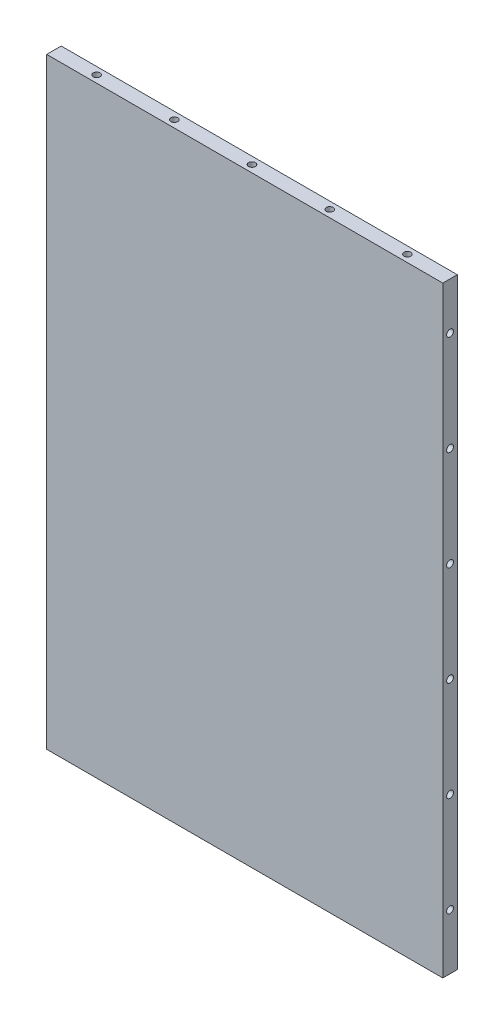
ISO-10303-21;
HEADER;
FILE_DESCRIPTION(('STEP AP214'),'2;1');
FILE_NAME('part.step','',(''),(''),'','','');
FILE_SCHEMA(('AUTOMOTIVE_DESIGN { 1 0 10303 214 1 1 1 1 }'));
ENDSEC;
DATA;
#1=APPLICATION_CONTEXT('core data for automotive mechanical design processes');
#2=APPLICATION_PROTOCOL_DEFINITION('international standard','automotive_design',2000,#1);
#3=PRODUCT_CONTEXT('',#1,'mechanical');
#4=PRODUCT('Part','Part','',(#3));
#5=PRODUCT_RELATED_PRODUCT_CATEGORY('part','',(#4));
#6=PRODUCT_DEFINITION_FORMATION('','',#4);
#7=PRODUCT_DEFINITION_CONTEXT('part definition',#1,'design');
#8=PRODUCT_DEFINITION('design','',#6,#7);
#9=PRODUCT_DEFINITION_SHAPE('','',#8);
#10=(LENGTH_UNIT() NAMED_UNIT(*) SI_UNIT(.MILLI.,.METRE.));
#11=(NAMED_UNIT(*) PLANE_ANGLE_UNIT() SI_UNIT($,.RADIAN.));
#12=(NAMED_UNIT(*) SI_UNIT($,.STERADIAN.) SOLID_ANGLE_UNIT());
#13=UNCERTAINTY_MEASURE_WITH_UNIT(LENGTH_MEASURE(1.E-05),#10,'distance_accuracy_value','');
#14=(GEOMETRIC_REPRESENTATION_CONTEXT(3) GLOBAL_UNCERTAINTY_ASSIGNED_CONTEXT((#13)) GLOBAL_UNIT_ASSIGNED_CONTEXT((#10,
#11,#12)) REPRESENTATION_CONTEXT('',''));
#15=CARTESIAN_POINT('',(0.,0.,0.));
#16=DIRECTION('',(0.,0.,1.));
#17=DIRECTION('',(1.,0.,0.));
#18=AXIS2_PLACEMENT_3D('',#15,#16,#17);
#19=CARTESIAN_POINT('',(232.,-733.,17.));
#20=DIRECTION('',(0.,1.,0.));
#21=DIRECTION('',(0.,0.,1.));
#22=AXIS2_PLACEMENT_3D('',#19,#20,#21);
#23=PLANE('',#22);
#24=CARTESIAN_POINT('',(0.,-733.,8.50000000000006));
#25=DIRECTION('',(0.,1.,0.));
#26=DIRECTION('',(0.,0.,1.));
#27=AXIS2_PLACEMENT_3D('',#24,#25,#26);
#28=CIRCLE('',#27,4.00000000000001);
#29=CARTESIAN_POINT('',(0.,-733.,12.5000000000001));
#30=VERTEX_POINT('',#29);
#31=EDGE_CURVE('E200',#30,#30,#28,.F.);
#32=ORIENTED_EDGE('',*,*,#31,.F.);
#33=EDGE_LOOP('',(#32));
#34=FACE_BOUND('',#33,.T.);
#35=CARTESIAN_POINT('',(-182.,-733.,8.50000000000009));
#36=DIRECTION('',(0.,1.,0.));
#37=DIRECTION('',(0.,0.,1.));
#38=AXIS2_PLACEMENT_3D('',#35,#36,#37);
#39=CIRCLE('',#38,3.99999999999999);
#40=CARTESIAN_POINT('',(-182.,-733.,12.5000000000001));
#41=VERTEX_POINT('',#40);
#42=EDGE_CURVE('E193',#41,#41,#39,.F.);
#43=ORIENTED_EDGE('',*,*,#42,.F.);
#44=EDGE_LOOP('',(#43));
#45=FACE_BOUND('',#44,.T.);
#46=DIRECTION('',(1.,0.,0.));
#47=VECTOR('',#46,1.);
#48=CARTESIAN_POINT('',(232.,-733.,0.));
#49=LINE('',#48,#47);
#50=CARTESIAN_POINT('',(-232.,-733.,0.));
#51=VERTEX_POINT('',#50);
#52=CARTESIAN_POINT('',(232.,-733.,0.));
#53=VERTEX_POINT('',#52);
#54=EDGE_CURVE('E87',#51,#53,#49,.T.);
#55=ORIENTED_EDGE('',*,*,#54,.T.);
#56=DIRECTION('',(0.,0.,-1.));
#57=VECTOR('',#56,1.);
#58=CARTESIAN_POINT('',(232.,-733.,17.));
#59=LINE('',#58,#57);
#60=CARTESIAN_POINT('',(232.,-733.,17.));
#61=VERTEX_POINT('',#60);
#62=EDGE_CURVE('E109',#61,#53,#59,.T.);
#63=ORIENTED_EDGE('',*,*,#62,.F.);
#64=DIRECTION('',(1.,0.,0.));
#65=VECTOR('',#64,1.);
#66=CARTESIAN_POINT('',(232.,-733.,17.));
#67=LINE('',#66,#65);
#68=CARTESIAN_POINT('',(-232.,-733.,17.));
#69=VERTEX_POINT('',#68);
#70=EDGE_CURVE('E64',#69,#61,#67,.T.);
#71=ORIENTED_EDGE('',*,*,#70,.F.);
#72=DIRECTION('',(0.,0.,-1.));
#73=VECTOR('',#72,1.);
#74=CARTESIAN_POINT('',(-232.,-733.,17.));
#75=LINE('',#74,#73);
#76=EDGE_CURVE('E105',#69,#51,#75,.T.);
#77=ORIENTED_EDGE('',*,*,#76,.T.);
#78=EDGE_LOOP('',(#55,#63,#71,#77));
#79=FACE_BOUND('',#78,.T.);
#80=CARTESIAN_POINT('',(182.,-733.,8.50000000000004));
#81=DIRECTION('',(0.,1.,0.));
#82=DIRECTION('',(0.,0.,1.));
#83=AXIS2_PLACEMENT_3D('',#80,#81,#82);
#84=CIRCLE('',#83,3.99999999999999);
#85=CARTESIAN_POINT('',(182.,-733.,12.5));
#86=VERTEX_POINT('',#85);
#87=EDGE_CURVE('E189',#86,#86,#84,.F.);
#88=ORIENTED_EDGE('',*,*,#87,.F.);
#89=EDGE_LOOP('',(#88));
#90=FACE_BOUND('',#89,.T.);
#91=CARTESIAN_POINT('',(91.,-733.,8.50000000000004));
#92=DIRECTION('',(0.,1.,0.));
#93=DIRECTION('',(0.,0.,1.));
#94=AXIS2_PLACEMENT_3D('',#91,#92,#93);
#95=CIRCLE('',#94,3.99999999999999);
#96=CARTESIAN_POINT('',(91.,-733.,12.5));
#97=VERTEX_POINT('',#96);
#98=EDGE_CURVE('E197',#97,#97,#95,.F.);
#99=ORIENTED_EDGE('',*,*,#98,.F.);
#100=EDGE_LOOP('',(#99));
#101=FACE_BOUND('',#100,.T.);
#102=CARTESIAN_POINT('',(-91.,-733.,8.50000000000006));
#103=DIRECTION('',(0.,1.,0.));
#104=DIRECTION('',(0.,0.,1.));
#105=AXIS2_PLACEMENT_3D('',#102,#103,#104);
#106=CIRCLE('',#105,3.99999999999999);
#107=CARTESIAN_POINT('',(-91.,-733.,12.5000000000001));
#108=VERTEX_POINT('',#107);
#109=EDGE_CURVE('E49',#108,#108,#106,.F.);
#110=ORIENTED_EDGE('',*,*,#109,.F.);
#111=EDGE_LOOP('',(#110));
#112=FACE_BOUND('',#111,.T.);
#113=ADVANCED_FACE('F45',(#34,#45,#79,#90,#101,#112),#23,.F.);
#114=CARTESIAN_POINT('',(232.,-28.,17.));
#115=DIRECTION('',(-1.,0.,0.));
#116=DIRECTION('',(0.,-1.,0.));
#117=AXIS2_PLACEMENT_3D('',#114,#115,#116);
#118=PLANE('',#117);
#119=CARTESIAN_POINT('',(232.,-551.,8.50000000000006));
#120=DIRECTION('',(-1.,0.,0.));
#121=DIRECTION('',(0.,-1.,0.));
#122=AXIS2_PLACEMENT_3D('',#119,#120,#121);
#123=CIRCLE('',#122,3.99999999999999);
#124=CARTESIAN_POINT('',(232.,-555.,8.50000000000006));
#125=VERTEX_POINT('',#124);
#126=EDGE_CURVE('E157',#125,#125,#123,.F.);
#127=ORIENTED_EDGE('',*,*,#126,.F.);
#128=EDGE_LOOP('',(#127));
#129=FACE_BOUND('',#128,.T.);
#130=CARTESIAN_POINT('',(232.,-200.,8.50000000000004));
#131=DIRECTION('',(-1.,0.,0.));
#132=DIRECTION('',(0.,-1.,0.));
#133=AXIS2_PLACEMENT_3D('',#130,#131,#132);
#134=CIRCLE('',#133,3.99999999999999);
#135=CARTESIAN_POINT('',(232.,-204.,8.50000000000004));
#136=VERTEX_POINT('',#135);
#137=EDGE_CURVE('E149',#136,#136,#134,.F.);
#138=ORIENTED_EDGE('',*,*,#137,.F.);
#139=EDGE_LOOP('',(#138));
#140=FACE_BOUND('',#139,.T.);
#141=CARTESIAN_POINT('',(232.,-83.,8.50000000000001));
#142=DIRECTION('',(-1.,0.,0.));
#143=DIRECTION('',(0.,-1.,0.));
#144=AXIS2_PLACEMENT_3D('',#141,#142,#143);
#145=CIRCLE('',#144,3.99999999999999);
#146=CARTESIAN_POINT('',(232.,-87.,8.50000000000001));
#147=VERTEX_POINT('',#146);
#148=EDGE_CURVE('E141',#147,#147,#145,.F.);
#149=ORIENTED_EDGE('',*,*,#148,.F.);
#150=EDGE_LOOP('',(#149));
#151=FACE_BOUND('',#150,.T.);
#152=DIRECTION('',(0.,1.,0.));
#153=VECTOR('',#152,1.);
#154=CARTESIAN_POINT('',(232.,-28.,0.));
#155=LINE('',#154,#153);
#156=CARTESIAN_POINT('',(232.,-28.,0.));
#157=VERTEX_POINT('',#156);
#158=EDGE_CURVE('E113',#53,#157,#155,.T.);
#159=ORIENTED_EDGE('',*,*,#158,.T.);
#160=DIRECTION('',(0.,0.,-1.));
#161=VECTOR('',#160,1.);
#162=CARTESIAN_POINT('',(232.,-28.,17.));
#163=LINE('',#162,#161);
#164=CARTESIAN_POINT('',(232.,-28.,17.));
#165=VERTEX_POINT('',#164);
#166=EDGE_CURVE('E13',#165,#157,#163,.T.);
#167=ORIENTED_EDGE('',*,*,#166,.F.);
#168=DIRECTION('',(0.,1.,0.));
#169=VECTOR('',#168,1.);
#170=CARTESIAN_POINT('',(232.,-28.,17.));
#171=LINE('',#170,#169);
#172=EDGE_CURVE('E99',#61,#165,#171,.T.);
#173=ORIENTED_EDGE('',*,*,#172,.F.);
#174=ORIENTED_EDGE('',*,*,#62,.T.);
#175=EDGE_LOOP('',(#159,#167,#173,#174));
#176=FACE_BOUND('',#175,.T.);
#177=CARTESIAN_POINT('',(232.,-317.,8.50000000000004));
#178=DIRECTION('',(-1.,0.,0.));
#179=DIRECTION('',(0.,-1.,0.));
#180=AXIS2_PLACEMENT_3D('',#177,#178,#179);
#181=CIRCLE('',#180,3.99999999999999);
#182=CARTESIAN_POINT('',(232.,-321.,8.50000000000004));
#183=VERTEX_POINT('',#182);
#184=EDGE_CURVE('E145',#183,#183,#181,.F.);
#185=ORIENTED_EDGE('',*,*,#184,.F.);
#186=EDGE_LOOP('',(#185));
#187=FACE_BOUND('',#186,.T.);
#188=CARTESIAN_POINT('',(232.,-434.,8.50000000000006));
#189=DIRECTION('',(-1.,0.,0.));
#190=DIRECTION('',(0.,-1.,0.));
#191=AXIS2_PLACEMENT_3D('',#188,#189,#190);
#192=CIRCLE('',#191,3.99999999999999);
#193=CARTESIAN_POINT('',(232.,-438.,8.50000000000006));
#194=VERTEX_POINT('',#193);
#195=EDGE_CURVE('E153',#194,#194,#192,.F.);
#196=ORIENTED_EDGE('',*,*,#195,.F.);
#197=EDGE_LOOP('',(#196));
#198=FACE_BOUND('',#197,.T.);
#199=CARTESIAN_POINT('',(232.,-668.,8.50000000000009));
#200=DIRECTION('',(-1.,0.,0.));
#201=DIRECTION('',(0.,-1.,0.));
#202=AXIS2_PLACEMENT_3D('',#199,#200,#201);
#203=CIRCLE('',#202,3.99999999999999);
#204=CARTESIAN_POINT('',(232.,-672.,8.50000000000009));
#205=VERTEX_POINT('',#204);
#206=EDGE_CURVE('E161',#205,#205,#203,.F.);
#207=ORIENTED_EDGE('',*,*,#206,.F.);
#208=EDGE_LOOP('',(#207));
#209=FACE_BOUND('',#208,.T.);
#210=ADVANCED_FACE('F47',(#129,#140,#151,#176,#187,#198,#209),#118,.F.);
#211=CARTESIAN_POINT('',(232.,-28.,17.));
#212=DIRECTION('',(0.,-1.,0.));
#213=DIRECTION('',(1.,0.,0.));
#214=AXIS2_PLACEMENT_3D('',#211,#212,#213);
#215=PLANE('',#214);
#216=CARTESIAN_POINT('',(0.,-28.,8.49999999999998));
#217=DIRECTION('',(0.,-1.,0.));
#218=DIRECTION('',(1.,0.,0.));
#219=AXIS2_PLACEMENT_3D('',#216,#217,#218);
#220=CIRCLE('',#219,4.00000000000001);
#221=CARTESIAN_POINT('',(4.00000000000001,-28.,8.49999999999998));
#222=VERTEX_POINT('',#221);
#223=EDGE_CURVE('E133',#222,#222,#220,.F.);
#224=ORIENTED_EDGE('',*,*,#223,.F.);
#225=EDGE_LOOP('',(#224));
#226=FACE_BOUND('',#225,.T.);
#227=CARTESIAN_POINT('',(-182.,-28.,8.49999999999995));
#228=DIRECTION('',(0.,-1.,0.));
#229=DIRECTION('',(1.,0.,0.));
#230=AXIS2_PLACEMENT_3D('',#227,#228,#229);
#231=CIRCLE('',#230,3.99999999999999);
#232=CARTESIAN_POINT('',(-178.,-28.,8.49999999999995));
#233=VERTEX_POINT('',#232);
#234=EDGE_CURVE('E125',#233,#233,#231,.F.);
#235=ORIENTED_EDGE('',*,*,#234,.F.);
#236=EDGE_LOOP('',(#235));
#237=FACE_BOUND('',#236,.T.);
#238=DIRECTION('',(-1.,0.,0.));
#239=VECTOR('',#238,1.);
#240=CARTESIAN_POINT('',(232.,-28.,0.));
#241=LINE('',#240,#239);
#242=CARTESIAN_POINT('',(-232.,-28.0000000000001,0.));
#243=VERTEX_POINT('',#242);
#244=EDGE_CURVE('E104',#157,#243,#241,.T.);
#245=ORIENTED_EDGE('',*,*,#244,.T.);
#246=DIRECTION('',(0.,0.,-1.));
#247=VECTOR('',#246,1.);
#248=CARTESIAN_POINT('',(-232.,-28.0000000000001,17.));
#249=LINE('',#248,#247);
#250=CARTESIAN_POINT('',(-232.,-28.0000000000001,17.));
#251=VERTEX_POINT('',#250);
#252=EDGE_CURVE('E55',#251,#243,#249,.T.);
#253=ORIENTED_EDGE('',*,*,#252,.F.);
#254=DIRECTION('',(-1.,0.,0.));
#255=VECTOR('',#254,1.);
#256=CARTESIAN_POINT('',(232.,-28.,17.));
#257=LINE('',#256,#255);
#258=EDGE_CURVE('E94',#165,#251,#257,.T.);
#259=ORIENTED_EDGE('',*,*,#258,.F.);
#260=ORIENTED_EDGE('',*,*,#166,.T.);
#261=EDGE_LOOP('',(#245,#253,#259,#260));
#262=FACE_BOUND('',#261,.T.);
#263=CARTESIAN_POINT('',(182.,-28.,8.50000000000001));
#264=DIRECTION('',(0.,-1.,0.));
#265=DIRECTION('',(1.,0.,0.));
#266=AXIS2_PLACEMENT_3D('',#263,#264,#265);
#267=CIRCLE('',#266,3.99999999999999);
#268=CARTESIAN_POINT('',(186.,-28.,8.50000000000001));
#269=VERTEX_POINT('',#268);
#270=EDGE_CURVE('E116',#269,#269,#267,.F.);
#271=ORIENTED_EDGE('',*,*,#270,.F.);
#272=EDGE_LOOP('',(#271));
#273=FACE_BOUND('',#272,.T.);
#274=CARTESIAN_POINT('',(91.,-28.,8.50000000000001));
#275=DIRECTION('',(0.,-1.,0.));
#276=DIRECTION('',(1.,0.,0.));
#277=AXIS2_PLACEMENT_3D('',#274,#275,#276);
#278=CIRCLE('',#277,3.99999999999999);
#279=CARTESIAN_POINT('',(95.,-28.,8.50000000000001));
#280=VERTEX_POINT('',#279);
#281=EDGE_CURVE('E129',#280,#280,#278,.F.);
#282=ORIENTED_EDGE('',*,*,#281,.F.);
#283=EDGE_LOOP('',(#282));
#284=FACE_BOUND('',#283,.T.);
#285=CARTESIAN_POINT('',(-91.,-28.,8.49999999999998));
#286=DIRECTION('',(0.,-1.,0.));
#287=DIRECTION('',(1.,0.,0.));
#288=AXIS2_PLACEMENT_3D('',#285,#286,#287);
#289=CIRCLE('',#288,3.99999999999999);
#290=CARTESIAN_POINT('',(-87.,-28.,8.49999999999998));
#291=VERTEX_POINT('',#290);
#292=EDGE_CURVE('E137',#291,#291,#289,.F.);
#293=ORIENTED_EDGE('',*,*,#292,.F.);
#294=EDGE_LOOP('',(#293));
#295=FACE_BOUND('',#294,.T.);
#296=ADVANCED_FACE('F102',(#226,#237,#262,#273,#284,#295),#215,.F.);
#297=CARTESIAN_POINT('',(-232.,-28.0000000000001,17.));
#298=DIRECTION('',(1.,0.,0.));
#299=DIRECTION('',(0.,1.,0.));
#300=AXIS2_PLACEMENT_3D('',#297,#298,#299);
#301=PLANE('',#300);
#302=CARTESIAN_POINT('',(-232.,-668.,8.50000000000009));
#303=DIRECTION('',(1.,0.,0.));
#304=DIRECTION('',(0.,1.,0.));
#305=AXIS2_PLACEMENT_3D('',#302,#303,#304);
#306=CIRCLE('',#305,3.99999999999999);
#307=CARTESIAN_POINT('',(-232.,-664.,8.50000000000009));
#308=VERTEX_POINT('',#307);
#309=EDGE_CURVE('E185',#308,#308,#306,.T.);
#310=ORIENTED_EDGE('',*,*,#309,.T.);
#311=EDGE_LOOP('',(#310));
#312=FACE_BOUND('',#311,.T.);
#313=CARTESIAN_POINT('',(-232.,-551.,8.50000000000006));
#314=DIRECTION('',(1.,0.,0.));
#315=DIRECTION('',(0.,1.,0.));
#316=AXIS2_PLACEMENT_3D('',#313,#314,#315);
#317=CIRCLE('',#316,3.99999999999999);
#318=CARTESIAN_POINT('',(-232.,-547.,8.50000000000006));
#319=VERTEX_POINT('',#318);
#320=EDGE_CURVE('E181',#319,#319,#317,.T.);
#321=ORIENTED_EDGE('',*,*,#320,.T.);
#322=EDGE_LOOP('',(#321));
#323=FACE_BOUND('',#322,.T.);
#324=CARTESIAN_POINT('',(-232.,-434.,8.50000000000006));
#325=DIRECTION('',(1.,0.,0.));
#326=DIRECTION('',(0.,1.,0.));
#327=AXIS2_PLACEMENT_3D('',#324,#325,#326);
#328=CIRCLE('',#327,3.99999999999999);
#329=CARTESIAN_POINT('',(-232.,-430.,8.50000000000006));
#330=VERTEX_POINT('',#329);
#331=EDGE_CURVE('E177',#330,#330,#328,.T.);
#332=ORIENTED_EDGE('',*,*,#331,.T.);
#333=EDGE_LOOP('',(#332));
#334=FACE_BOUND('',#333,.T.);
#335=CARTESIAN_POINT('',(-232.,-200.,8.50000000000004));
#336=DIRECTION('',(1.,0.,0.));
#337=DIRECTION('',(0.,1.,0.));
#338=AXIS2_PLACEMENT_3D('',#335,#336,#337);
#339=CIRCLE('',#338,3.99999999999999);
#340=CARTESIAN_POINT('',(-232.,-196.,8.50000000000004));
#341=VERTEX_POINT('',#340);
#342=EDGE_CURVE('E173',#341,#341,#339,.T.);
#343=ORIENTED_EDGE('',*,*,#342,.T.);
#344=EDGE_LOOP('',(#343));
#345=FACE_BOUND('',#344,.T.);
#346=CARTESIAN_POINT('',(-232.,-317.,8.50000000000004));
#347=DIRECTION('',(1.,0.,0.));
#348=DIRECTION('',(0.,1.,0.));
#349=AXIS2_PLACEMENT_3D('',#346,#347,#348);
#350=CIRCLE('',#349,3.99999999999999);
#351=CARTESIAN_POINT('',(-232.,-313.,8.50000000000004));
#352=VERTEX_POINT('',#351);
#353=EDGE_CURVE('E169',#352,#352,#350,.T.);
#354=ORIENTED_EDGE('',*,*,#353,.T.);
#355=EDGE_LOOP('',(#354));
#356=FACE_BOUND('',#355,.T.);
#357=CARTESIAN_POINT('',(-232.,-83.,8.50000000000001));
#358=DIRECTION('',(1.,0.,0.));
#359=DIRECTION('',(0.,1.,0.));
#360=AXIS2_PLACEMENT_3D('',#357,#358,#359);
#361=CIRCLE('',#360,3.99999999999999);
#362=CARTESIAN_POINT('',(-232.,-79.,8.50000000000001));
#363=VERTEX_POINT('',#362);
#364=EDGE_CURVE('E165',#363,#363,#361,.T.);
#365=ORIENTED_EDGE('',*,*,#364,.T.);
#366=EDGE_LOOP('',(#365));
#367=FACE_BOUND('',#366,.T.);
#368=DIRECTION('',(0.,-1.,0.));
#369=VECTOR('',#368,1.);
#370=CARTESIAN_POINT('',(-232.,-28.0000000000001,0.));
#371=LINE('',#370,#369);
#372=EDGE_CURVE('E81',#243,#51,#371,.T.);
#373=ORIENTED_EDGE('',*,*,#372,.T.);
#374=ORIENTED_EDGE('',*,*,#76,.F.);
#375=DIRECTION('',(0.,-1.,0.));
#376=VECTOR('',#375,1.);
#377=CARTESIAN_POINT('',(-232.,-28.0000000000001,17.));
#378=LINE('',#377,#376);
#379=EDGE_CURVE('E97',#251,#69,#378,.T.);
#380=ORIENTED_EDGE('',*,*,#379,.F.);
#381=ORIENTED_EDGE('',*,*,#252,.T.);
#382=EDGE_LOOP('',(#373,#374,#380,#381));
#383=FACE_BOUND('',#382,.T.);
#384=ADVANCED_FACE('F107',(#312,#323,#334,#345,#356,#367,#383),#301,.F.);
#385=CARTESIAN_POINT('',(0.,0.,17.));
#386=DIRECTION('',(0.,0.,-1.));
#387=DIRECTION('',(-1.,0.,0.));
#388=AXIS2_PLACEMENT_3D('',#385,#386,#387);
#389=PLANE('',#388);
#390=ORIENTED_EDGE('',*,*,#172,.T.);
#391=ORIENTED_EDGE('',*,*,#258,.T.);
#392=ORIENTED_EDGE('',*,*,#379,.T.);
#393=ORIENTED_EDGE('',*,*,#70,.T.);
#394=EDGE_LOOP('',(#390,#391,#392,#393));
#395=FACE_BOUND('',#394,.T.);
#396=ADVANCED_FACE('F95',(#395),#389,.F.);
#397=CARTESIAN_POINT('',(0.,0.,0.));
#398=DIRECTION('',(0.,0.,-1.));
#399=DIRECTION('',(-1.,0.,0.));
#400=AXIS2_PLACEMENT_3D('',#397,#398,#399);
#401=PLANE('',#400);
#402=ORIENTED_EDGE('',*,*,#158,.F.);
#403=ORIENTED_EDGE('',*,*,#54,.F.);
#404=ORIENTED_EDGE('',*,*,#372,.F.);
#405=ORIENTED_EDGE('',*,*,#244,.F.);
#406=EDGE_LOOP('',(#402,#403,#404,#405));
#407=FACE_BOUND('',#406,.T.);
#408=ADVANCED_FACE('F268',(#407),#401,.T.);
#409=CARTESIAN_POINT('',(182.,-53.,8.50000000000001));
#410=DIRECTION('',(0.,1.,0.));
#411=DIRECTION('',(0.,0.,1.));
#412=AXIS2_PLACEMENT_3D('',#409,#410,#411);
#413=CYLINDRICAL_SURFACE('',#412,3.99999999999999);
#414=CARTESIAN_POINT('',(182.,-53.,8.50000000000001));
#415=DIRECTION('',(0.,-1.,0.));
#416=DIRECTION('',(0.,0.,-1.));
#417=AXIS2_PLACEMENT_3D('',#414,#415,#416);
#418=CIRCLE('',#417,3.99999999999999);
#419=CARTESIAN_POINT('',(182.,-53.,4.50000000000001));
#420=VERTEX_POINT('',#419);
#421=EDGE_CURVE('E124',#420,#420,#418,.T.);
#422=ORIENTED_EDGE('',*,*,#421,.T.);
#423=EDGE_LOOP('',(#422));
#424=FACE_BOUND('',#423,.T.);
#425=ORIENTED_EDGE('',*,*,#270,.T.);
#426=EDGE_LOOP('',(#425));
#427=FACE_BOUND('',#426,.T.);
#428=ADVANCED_FACE('F254',(#424,#427),#413,.F.);
#429=CARTESIAN_POINT('',(182.,-53.,8.50000000000001));
#430=DIRECTION('',(0.,-1.,0.));
#431=DIRECTION('',(0.,0.,-1.));
#432=AXIS2_PLACEMENT_3D('',#429,#430,#431);
#433=PLANE('',#432);
#434=ORIENTED_EDGE('',*,*,#421,.F.);
#435=EDGE_LOOP('',(#434));
#436=FACE_BOUND('',#435,.T.);
#437=ADVANCED_FACE('F257',(#436),#433,.F.);
#438=CARTESIAN_POINT('',(-182.,-53.,8.49999999999995));
#439=DIRECTION('',(0.,1.,0.));
#440=DIRECTION('',(0.,0.,1.));
#441=AXIS2_PLACEMENT_3D('',#438,#439,#440);
#442=CYLINDRICAL_SURFACE('',#441,3.99999999999999);
#443=CARTESIAN_POINT('',(-182.,-53.,8.49999999999995));
#444=DIRECTION('',(0.,-1.,0.));
#445=DIRECTION('',(0.,0.,-1.));
#446=AXIS2_PLACEMENT_3D('',#443,#444,#445);
#447=CIRCLE('',#446,3.99999999999999);
#448=CARTESIAN_POINT('',(-182.,-53.,4.49999999999996));
#449=VERTEX_POINT('',#448);
#450=EDGE_CURVE('E128',#449,#449,#447,.T.);
#451=ORIENTED_EDGE('',*,*,#450,.T.);
#452=EDGE_LOOP('',(#451));
#453=FACE_BOUND('',#452,.T.);
#454=ORIENTED_EDGE('',*,*,#234,.T.);
#455=EDGE_LOOP('',(#454));
#456=FACE_BOUND('',#455,.T.);
#457=ADVANCED_FACE('F259',(#453,#456),#442,.F.);
#458=CARTESIAN_POINT('',(-182.,-53.,8.49999999999995));
#459=DIRECTION('',(0.,-1.,0.));
#460=DIRECTION('',(0.,0.,-1.));
#461=AXIS2_PLACEMENT_3D('',#458,#459,#460);
#462=PLANE('',#461);
#463=ORIENTED_EDGE('',*,*,#450,.F.);
#464=EDGE_LOOP('',(#463));
#465=FACE_BOUND('',#464,.T.);
#466=ADVANCED_FACE('F265',(#465),#462,.F.);
#467=CARTESIAN_POINT('',(91.,-53.,8.50000000000001));
#468=DIRECTION('',(0.,1.,0.));
#469=DIRECTION('',(0.,0.,1.));
#470=AXIS2_PLACEMENT_3D('',#467,#468,#469);
#471=CYLINDRICAL_SURFACE('',#470,3.99999999999999);
#472=CARTESIAN_POINT('',(91.,-53.,8.50000000000001));
#473=DIRECTION('',(0.,-1.,0.));
#474=DIRECTION('',(0.,0.,-1.));
#475=AXIS2_PLACEMENT_3D('',#472,#473,#474);
#476=CIRCLE('',#475,3.99999999999999);
#477=CARTESIAN_POINT('',(91.,-53.,4.50000000000001));
#478=VERTEX_POINT('',#477);
#479=EDGE_CURVE('E132',#478,#478,#476,.T.);
#480=ORIENTED_EDGE('',*,*,#479,.T.);
#481=EDGE_LOOP('',(#480));
#482=FACE_BOUND('',#481,.T.);
#483=ORIENTED_EDGE('',*,*,#281,.T.);
#484=EDGE_LOOP('',(#483));
#485=FACE_BOUND('',#484,.T.);
#486=ADVANCED_FACE('F305',(#482,#485),#471,.F.);
#487=CARTESIAN_POINT('',(91.,-53.,8.50000000000001));
#488=DIRECTION('',(0.,-1.,0.));
#489=DIRECTION('',(0.,0.,-1.));
#490=AXIS2_PLACEMENT_3D('',#487,#488,#489);
#491=PLANE('',#490);
#492=ORIENTED_EDGE('',*,*,#479,.F.);
#493=EDGE_LOOP('',(#492));
#494=FACE_BOUND('',#493,.T.);
#495=ADVANCED_FACE('F295',(#494),#491,.F.);
#496=CARTESIAN_POINT('',(0.,-53.,8.49999999999998));
#497=DIRECTION('',(0.,1.,0.));
#498=DIRECTION('',(0.,0.,1.));
#499=AXIS2_PLACEMENT_3D('',#496,#497,#498);
#500=CYLINDRICAL_SURFACE('',#499,4.00000000000001);
#501=CARTESIAN_POINT('',(0.,-53.,8.49999999999998));
#502=DIRECTION('',(0.,-1.,0.));
#503=DIRECTION('',(0.,0.,-1.));
#504=AXIS2_PLACEMENT_3D('',#501,#502,#503);
#505=CIRCLE('',#504,4.00000000000001);
#506=CARTESIAN_POINT('',(0.,-53.,4.49999999999997));
#507=VERTEX_POINT('',#506);
#508=EDGE_CURVE('E136',#507,#507,#505,.T.);
#509=ORIENTED_EDGE('',*,*,#508,.T.);
#510=EDGE_LOOP('',(#509));
#511=FACE_BOUND('',#510,.T.);
#512=ORIENTED_EDGE('',*,*,#223,.T.);
#513=EDGE_LOOP('',(#512));
#514=FACE_BOUND('',#513,.T.);
#515=ADVANCED_FACE('F292',(#511,#514),#500,.F.);
#516=CARTESIAN_POINT('',(0.,-53.,8.49999999999998));
#517=DIRECTION('',(0.,-1.,0.));
#518=DIRECTION('',(0.,0.,-1.));
#519=AXIS2_PLACEMENT_3D('',#516,#517,#518);
#520=PLANE('',#519);
#521=ORIENTED_EDGE('',*,*,#508,.F.);
#522=EDGE_LOOP('',(#521));
#523=FACE_BOUND('',#522,.T.);
#524=ADVANCED_FACE('F294',(#523),#520,.F.);
#525=CARTESIAN_POINT('',(-91.,-53.,8.49999999999998));
#526=DIRECTION('',(0.,1.,0.));
#527=DIRECTION('',(0.,0.,1.));
#528=AXIS2_PLACEMENT_3D('',#525,#526,#527);
#529=CYLINDRICAL_SURFACE('',#528,3.99999999999999);
#530=CARTESIAN_POINT('',(-91.,-53.,8.49999999999998));
#531=DIRECTION('',(0.,-1.,0.));
#532=DIRECTION('',(0.,0.,-1.));
#533=AXIS2_PLACEMENT_3D('',#530,#531,#532);
#534=CIRCLE('',#533,3.99999999999999);
#535=CARTESIAN_POINT('',(-91.,-53.,4.49999999999999));
#536=VERTEX_POINT('',#535);
#537=EDGE_CURVE('E140',#536,#536,#534,.T.);
#538=ORIENTED_EDGE('',*,*,#537,.T.);
#539=EDGE_LOOP('',(#538));
#540=FACE_BOUND('',#539,.T.);
#541=ORIENTED_EDGE('',*,*,#292,.T.);
#542=EDGE_LOOP('',(#541));
#543=FACE_BOUND('',#542,.T.);
#544=ADVANCED_FACE('F302',(#540,#543),#529,.F.);
#545=CARTESIAN_POINT('',(-91.,-53.,8.49999999999998));
#546=DIRECTION('',(0.,-1.,0.));
#547=DIRECTION('',(0.,0.,-1.));
#548=AXIS2_PLACEMENT_3D('',#545,#546,#547);
#549=PLANE('',#548);
#550=ORIENTED_EDGE('',*,*,#537,.F.);
#551=EDGE_LOOP('',(#550));
#552=FACE_BOUND('',#551,.T.);
#553=ADVANCED_FACE('F347',(#552),#549,.F.);
#554=CARTESIAN_POINT('',(207.,-83.,8.50000000000001));
#555=DIRECTION('',(1.,0.,0.));
#556=DIRECTION('',(0.,0.,-1.));
#557=AXIS2_PLACEMENT_3D('',#554,#555,#556);
#558=CYLINDRICAL_SURFACE('',#557,3.99999999999999);
#559=CARTESIAN_POINT('',(207.,-83.,8.50000000000001));
#560=DIRECTION('',(-1.,0.,0.));
#561=DIRECTION('',(0.,0.,1.));
#562=AXIS2_PLACEMENT_3D('',#559,#560,#561);
#563=CIRCLE('',#562,3.99999999999999);
#564=CARTESIAN_POINT('',(207.,-83.,12.5));
#565=VERTEX_POINT('',#564);
#566=EDGE_CURVE('E144',#565,#565,#563,.T.);
#567=ORIENTED_EDGE('',*,*,#566,.T.);
#568=EDGE_LOOP('',(#567));
#569=FACE_BOUND('',#568,.T.);
#570=ORIENTED_EDGE('',*,*,#148,.T.);
#571=EDGE_LOOP('',(#570));
#572=FACE_BOUND('',#571,.T.);
#573=ADVANCED_FACE('F356',(#569,#572),#558,.F.);
#574=CARTESIAN_POINT('',(207.,-83.,8.50000000000001));
#575=DIRECTION('',(-1.,0.,0.));
#576=DIRECTION('',(0.,0.,1.));
#577=AXIS2_PLACEMENT_3D('',#574,#575,#576);
#578=PLANE('',#577);
#579=ORIENTED_EDGE('',*,*,#566,.F.);
#580=EDGE_LOOP('',(#579));
#581=FACE_BOUND('',#580,.T.);
#582=ADVANCED_FACE('F372',(#581),#578,.F.);
#583=CARTESIAN_POINT('',(207.,-317.,8.50000000000004));
#584=DIRECTION('',(1.,0.,0.));
#585=DIRECTION('',(0.,0.,-1.));
#586=AXIS2_PLACEMENT_3D('',#583,#584,#585);
#587=CYLINDRICAL_SURFACE('',#586,3.99999999999999);
#588=CARTESIAN_POINT('',(207.,-317.,8.50000000000004));
#589=DIRECTION('',(-1.,0.,0.));
#590=DIRECTION('',(0.,0.,1.));
#591=AXIS2_PLACEMENT_3D('',#588,#589,#590);
#592=CIRCLE('',#591,3.99999999999999);
#593=CARTESIAN_POINT('',(207.,-317.,12.5));
#594=VERTEX_POINT('',#593);
#595=EDGE_CURVE('E148',#594,#594,#592,.T.);
#596=ORIENTED_EDGE('',*,*,#595,.T.);
#597=EDGE_LOOP('',(#596));
#598=FACE_BOUND('',#597,.T.);
#599=ORIENTED_EDGE('',*,*,#184,.T.);
#600=EDGE_LOOP('',(#599));
#601=FACE_BOUND('',#600,.T.);
#602=ADVANCED_FACE('F382',(#598,#601),#587,.F.);
#603=CARTESIAN_POINT('',(207.,-317.,8.50000000000004));
#604=DIRECTION('',(-1.,0.,0.));
#605=DIRECTION('',(0.,0.,1.));
#606=AXIS2_PLACEMENT_3D('',#603,#604,#605);
#607=PLANE('',#606);
#608=ORIENTED_EDGE('',*,*,#595,.F.);
#609=EDGE_LOOP('',(#608));
#610=FACE_BOUND('',#609,.T.);
#611=ADVANCED_FACE('F392',(#610),#607,.F.);
#612=CARTESIAN_POINT('',(207.,-200.,8.50000000000004));
#613=DIRECTION('',(1.,0.,0.));
#614=DIRECTION('',(0.,0.,-1.));
#615=AXIS2_PLACEMENT_3D('',#612,#613,#614);
#616=CYLINDRICAL_SURFACE('',#615,3.99999999999999);
#617=CARTESIAN_POINT('',(207.,-200.,8.50000000000004));
#618=DIRECTION('',(-1.,0.,0.));
#619=DIRECTION('',(0.,0.,1.));
#620=AXIS2_PLACEMENT_3D('',#617,#618,#619);
#621=CIRCLE('',#620,3.99999999999999);
#622=CARTESIAN_POINT('',(207.,-200.,12.5));
#623=VERTEX_POINT('',#622);
#624=EDGE_CURVE('E152',#623,#623,#621,.T.);
#625=ORIENTED_EDGE('',*,*,#624,.T.);
#626=EDGE_LOOP('',(#625));
#627=FACE_BOUND('',#626,.T.);
#628=ORIENTED_EDGE('',*,*,#137,.T.);
#629=EDGE_LOOP('',(#628));
#630=FACE_BOUND('',#629,.T.);
#631=ADVANCED_FACE('F402',(#627,#630),#616,.F.);
#632=CARTESIAN_POINT('',(207.,-200.,8.50000000000004));
#633=DIRECTION('',(-1.,0.,0.));
#634=DIRECTION('',(0.,0.,1.));
#635=AXIS2_PLACEMENT_3D('',#632,#633,#634);
#636=PLANE('',#635);
#637=ORIENTED_EDGE('',*,*,#624,.F.);
#638=EDGE_LOOP('',(#637));
#639=FACE_BOUND('',#638,.T.);
#640=ADVANCED_FACE('F412',(#639),#636,.F.);
#641=CARTESIAN_POINT('',(207.,-434.,8.50000000000006));
#642=DIRECTION('',(1.,0.,0.));
#643=DIRECTION('',(0.,0.,-1.));
#644=AXIS2_PLACEMENT_3D('',#641,#642,#643);
#645=CYLINDRICAL_SURFACE('',#644,3.99999999999999);
#646=CARTESIAN_POINT('',(207.,-434.,8.50000000000006));
#647=DIRECTION('',(-1.,0.,0.));
#648=DIRECTION('',(0.,0.,1.));
#649=AXIS2_PLACEMENT_3D('',#646,#647,#648);
#650=CIRCLE('',#649,3.99999999999999);
#651=CARTESIAN_POINT('',(207.,-434.,12.5000000000001));
#652=VERTEX_POINT('',#651);
#653=EDGE_CURVE('E156',#652,#652,#650,.T.);
#654=ORIENTED_EDGE('',*,*,#653,.T.);
#655=EDGE_LOOP('',(#654));
#656=FACE_BOUND('',#655,.T.);
#657=ORIENTED_EDGE('',*,*,#195,.T.);
#658=EDGE_LOOP('',(#657));
#659=FACE_BOUND('',#658,.T.);
#660=ADVANCED_FACE('F422',(#656,#659),#645,.F.);
#661=CARTESIAN_POINT('',(207.,-434.,8.50000000000006));
#662=DIRECTION('',(-1.,0.,0.));
#663=DIRECTION('',(0.,0.,1.));
#664=AXIS2_PLACEMENT_3D('',#661,#662,#663);
#665=PLANE('',#664);
#666=ORIENTED_EDGE('',*,*,#653,.F.);
#667=EDGE_LOOP('',(#666));
#668=FACE_BOUND('',#667,.T.);
#669=ADVANCED_FACE('F432',(#668),#665,.F.);
#670=CARTESIAN_POINT('',(207.,-551.,8.50000000000006));
#671=DIRECTION('',(1.,0.,0.));
#672=DIRECTION('',(0.,0.,-1.));
#673=AXIS2_PLACEMENT_3D('',#670,#671,#672);
#674=CYLINDRICAL_SURFACE('',#673,3.99999999999999);
#675=CARTESIAN_POINT('',(207.,-551.,8.50000000000006));
#676=DIRECTION('',(-1.,0.,0.));
#677=DIRECTION('',(0.,0.,1.));
#678=AXIS2_PLACEMENT_3D('',#675,#676,#677);
#679=CIRCLE('',#678,3.99999999999999);
#680=CARTESIAN_POINT('',(207.,-551.,12.5000000000001));
#681=VERTEX_POINT('',#680);
#682=EDGE_CURVE('E160',#681,#681,#679,.T.);
#683=ORIENTED_EDGE('',*,*,#682,.T.);
#684=EDGE_LOOP('',(#683));
#685=FACE_BOUND('',#684,.T.);
#686=ORIENTED_EDGE('',*,*,#126,.T.);
#687=EDGE_LOOP('',(#686));
#688=FACE_BOUND('',#687,.T.);
#689=ADVANCED_FACE('F442',(#685,#688),#674,.F.);
#690=CARTESIAN_POINT('',(207.,-551.,8.50000000000006));
#691=DIRECTION('',(-1.,0.,0.));
#692=DIRECTION('',(0.,0.,1.));
#693=AXIS2_PLACEMENT_3D('',#690,#691,#692);
#694=PLANE('',#693);
#695=ORIENTED_EDGE('',*,*,#682,.F.);
#696=EDGE_LOOP('',(#695));
#697=FACE_BOUND('',#696,.T.);
#698=ADVANCED_FACE('F452',(#697),#694,.F.);
#699=CARTESIAN_POINT('',(207.,-668.,8.50000000000009));
#700=DIRECTION('',(1.,0.,0.));
#701=DIRECTION('',(0.,0.,-1.));
#702=AXIS2_PLACEMENT_3D('',#699,#700,#701);
#703=CYLINDRICAL_SURFACE('',#702,3.99999999999999);
#704=CARTESIAN_POINT('',(207.,-668.,8.50000000000009));
#705=DIRECTION('',(-1.,0.,0.));
#706=DIRECTION('',(0.,0.,1.));
#707=AXIS2_PLACEMENT_3D('',#704,#705,#706);
#708=CIRCLE('',#707,3.99999999999999);
#709=CARTESIAN_POINT('',(207.,-668.,12.5000000000001));
#710=VERTEX_POINT('',#709);
#711=EDGE_CURVE('E164',#710,#710,#708,.T.);
#712=ORIENTED_EDGE('',*,*,#711,.T.);
#713=EDGE_LOOP('',(#712));
#714=FACE_BOUND('',#713,.T.);
#715=ORIENTED_EDGE('',*,*,#206,.T.);
#716=EDGE_LOOP('',(#715));
#717=FACE_BOUND('',#716,.T.);
#718=ADVANCED_FACE('F462',(#714,#717),#703,.F.);
#719=CARTESIAN_POINT('',(207.,-668.,8.50000000000009));
#720=DIRECTION('',(-1.,0.,0.));
#721=DIRECTION('',(0.,0.,1.));
#722=AXIS2_PLACEMENT_3D('',#719,#720,#721);
#723=PLANE('',#722);
#724=ORIENTED_EDGE('',*,*,#711,.F.);
#725=EDGE_LOOP('',(#724));
#726=FACE_BOUND('',#725,.T.);
#727=ADVANCED_FACE('F472',(#726),#723,.F.);
#728=CARTESIAN_POINT('',(-207.,-83.,8.50000000000001));
#729=DIRECTION('',(-1.,0.,0.));
#730=DIRECTION('',(0.,0.,1.));
#731=AXIS2_PLACEMENT_3D('',#728,#729,#730);
#732=CYLINDRICAL_SURFACE('',#731,3.99999999999999);
#733=CARTESIAN_POINT('',(-207.,-83.,8.50000000000001));
#734=DIRECTION('',(-1.,0.,0.));
#735=DIRECTION('',(0.,0.,1.));
#736=AXIS2_PLACEMENT_3D('',#733,#734,#735);
#737=CIRCLE('',#736,3.99999999999999);
#738=CARTESIAN_POINT('',(-207.,-83.,12.5));
#739=VERTEX_POINT('',#738);
#740=EDGE_CURVE('E168',#739,#739,#737,.T.);
#741=ORIENTED_EDGE('',*,*,#740,.F.);
#742=EDGE_LOOP('',(#741));
#743=FACE_BOUND('',#742,.T.);
#744=ORIENTED_EDGE('',*,*,#364,.F.);
#745=EDGE_LOOP('',(#744));
#746=FACE_BOUND('',#745,.T.);
#747=ADVANCED_FACE('F482',(#743,#746),#732,.F.);
#748=CARTESIAN_POINT('',(-207.,-83.,8.50000000000001));
#749=DIRECTION('',(1.,0.,0.));
#750=DIRECTION('',(0.,0.,1.));
#751=AXIS2_PLACEMENT_3D('',#748,#749,#750);
#752=PLANE('',#751);
#753=ORIENTED_EDGE('',*,*,#740,.T.);
#754=EDGE_LOOP('',(#753));
#755=FACE_BOUND('',#754,.T.);
#756=ADVANCED_FACE('F500',(#755),#752,.F.);
#757=CARTESIAN_POINT('',(-207.,-317.,8.50000000000004));
#758=DIRECTION('',(-1.,0.,0.));
#759=DIRECTION('',(0.,0.,1.));
#760=AXIS2_PLACEMENT_3D('',#757,#758,#759);
#761=CYLINDRICAL_SURFACE('',#760,3.99999999999999);
#762=CARTESIAN_POINT('',(-207.,-317.,8.50000000000004));
#763=DIRECTION('',(-1.,0.,0.));
#764=DIRECTION('',(0.,0.,1.));
#765=AXIS2_PLACEMENT_3D('',#762,#763,#764);
#766=CIRCLE('',#765,3.99999999999999);
#767=CARTESIAN_POINT('',(-207.,-317.,12.5));
#768=VERTEX_POINT('',#767);
#769=EDGE_CURVE('E172',#768,#768,#766,.T.);
#770=ORIENTED_EDGE('',*,*,#769,.F.);
#771=EDGE_LOOP('',(#770));
#772=FACE_BOUND('',#771,.T.);
#773=ORIENTED_EDGE('',*,*,#353,.F.);
#774=EDGE_LOOP('',(#773));
#775=FACE_BOUND('',#774,.T.);
#776=ADVANCED_FACE('F510',(#772,#775),#761,.F.);
#777=CARTESIAN_POINT('',(-207.,-317.,8.50000000000004));
#778=DIRECTION('',(1.,0.,0.));
#779=DIRECTION('',(0.,0.,1.));
#780=AXIS2_PLACEMENT_3D('',#777,#778,#779);
#781=PLANE('',#780);
#782=ORIENTED_EDGE('',*,*,#769,.T.);
#783=EDGE_LOOP('',(#782));
#784=FACE_BOUND('',#783,.T.);
#785=ADVANCED_FACE('F520',(#784),#781,.F.);
#786=CARTESIAN_POINT('',(-207.,-200.,8.50000000000004));
#787=DIRECTION('',(-1.,0.,0.));
#788=DIRECTION('',(0.,0.,1.));
#789=AXIS2_PLACEMENT_3D('',#786,#787,#788);
#790=CYLINDRICAL_SURFACE('',#789,3.99999999999999);
#791=CARTESIAN_POINT('',(-207.,-200.,8.50000000000004));
#792=DIRECTION('',(-1.,0.,0.));
#793=DIRECTION('',(0.,0.,1.));
#794=AXIS2_PLACEMENT_3D('',#791,#792,#793);
#795=CIRCLE('',#794,3.99999999999999);
#796=CARTESIAN_POINT('',(-207.,-200.,12.5));
#797=VERTEX_POINT('',#796);
#798=EDGE_CURVE('E176',#797,#797,#795,.T.);
#799=ORIENTED_EDGE('',*,*,#798,.F.);
#800=EDGE_LOOP('',(#799));
#801=FACE_BOUND('',#800,.T.);
#802=ORIENTED_EDGE('',*,*,#342,.F.);
#803=EDGE_LOOP('',(#802));
#804=FACE_BOUND('',#803,.T.);
#805=ADVANCED_FACE('F530',(#801,#804),#790,.F.);
#806=CARTESIAN_POINT('',(-207.,-200.,8.50000000000004));
#807=DIRECTION('',(1.,0.,0.));
#808=DIRECTION('',(0.,0.,1.));
#809=AXIS2_PLACEMENT_3D('',#806,#807,#808);
#810=PLANE('',#809);
#811=ORIENTED_EDGE('',*,*,#798,.T.);
#812=EDGE_LOOP('',(#811));
#813=FACE_BOUND('',#812,.T.);
#814=ADVANCED_FACE('F540',(#813),#810,.F.);
#815=CARTESIAN_POINT('',(-207.,-434.,8.50000000000006));
#816=DIRECTION('',(-1.,0.,0.));
#817=DIRECTION('',(0.,0.,1.));
#818=AXIS2_PLACEMENT_3D('',#815,#816,#817);
#819=CYLINDRICAL_SURFACE('',#818,3.99999999999999);
#820=CARTESIAN_POINT('',(-207.,-434.,8.50000000000006));
#821=DIRECTION('',(-1.,0.,0.));
#822=DIRECTION('',(0.,0.,1.));
#823=AXIS2_PLACEMENT_3D('',#820,#821,#822);
#824=CIRCLE('',#823,3.99999999999999);
#825=CARTESIAN_POINT('',(-207.,-434.,12.5000000000001));
#826=VERTEX_POINT('',#825);
#827=EDGE_CURVE('E180',#826,#826,#824,.T.);
#828=ORIENTED_EDGE('',*,*,#827,.F.);
#829=EDGE_LOOP('',(#828));
#830=FACE_BOUND('',#829,.T.);
#831=ORIENTED_EDGE('',*,*,#331,.F.);
#832=EDGE_LOOP('',(#831));
#833=FACE_BOUND('',#832,.T.);
#834=ADVANCED_FACE('F550',(#830,#833),#819,.F.);
#835=CARTESIAN_POINT('',(-207.,-434.,8.50000000000006));
#836=DIRECTION('',(1.,0.,0.));
#837=DIRECTION('',(0.,0.,1.));
#838=AXIS2_PLACEMENT_3D('',#835,#836,#837);
#839=PLANE('',#838);
#840=ORIENTED_EDGE('',*,*,#827,.T.);
#841=EDGE_LOOP('',(#840));
#842=FACE_BOUND('',#841,.T.);
#843=ADVANCED_FACE('F560',(#842),#839,.F.);
#844=CARTESIAN_POINT('',(-207.,-551.,8.50000000000006));
#845=DIRECTION('',(-1.,0.,0.));
#846=DIRECTION('',(0.,0.,1.));
#847=AXIS2_PLACEMENT_3D('',#844,#845,#846);
#848=CYLINDRICAL_SURFACE('',#847,3.99999999999999);
#849=CARTESIAN_POINT('',(-207.,-551.,8.50000000000006));
#850=DIRECTION('',(-1.,0.,0.));
#851=DIRECTION('',(0.,0.,1.));
#852=AXIS2_PLACEMENT_3D('',#849,#850,#851);
#853=CIRCLE('',#852,3.99999999999999);
#854=CARTESIAN_POINT('',(-207.,-551.,12.5000000000001));
#855=VERTEX_POINT('',#854);
#856=EDGE_CURVE('E184',#855,#855,#853,.T.);
#857=ORIENTED_EDGE('',*,*,#856,.F.);
#858=EDGE_LOOP('',(#857));
#859=FACE_BOUND('',#858,.T.);
#860=ORIENTED_EDGE('',*,*,#320,.F.);
#861=EDGE_LOOP('',(#860));
#862=FACE_BOUND('',#861,.T.);
#863=ADVANCED_FACE('F570',(#859,#862),#848,.F.);
#864=CARTESIAN_POINT('',(-207.,-551.,8.50000000000006));
#865=DIRECTION('',(1.,0.,0.));
#866=DIRECTION('',(0.,0.,1.));
#867=AXIS2_PLACEMENT_3D('',#864,#865,#866);
#868=PLANE('',#867);
#869=ORIENTED_EDGE('',*,*,#856,.T.);
#870=EDGE_LOOP('',(#869));
#871=FACE_BOUND('',#870,.T.);
#872=ADVANCED_FACE('F580',(#871),#868,.F.);
#873=CARTESIAN_POINT('',(-207.,-668.,8.50000000000009));
#874=DIRECTION('',(-1.,0.,0.));
#875=DIRECTION('',(0.,0.,1.));
#876=AXIS2_PLACEMENT_3D('',#873,#874,#875);
#877=CYLINDRICAL_SURFACE('',#876,3.99999999999999);
#878=CARTESIAN_POINT('',(-207.,-668.,8.50000000000009));
#879=DIRECTION('',(-1.,0.,0.));
#880=DIRECTION('',(0.,0.,1.));
#881=AXIS2_PLACEMENT_3D('',#878,#879,#880);
#882=CIRCLE('',#881,3.99999999999999);
#883=CARTESIAN_POINT('',(-207.,-668.,12.5000000000001));
#884=VERTEX_POINT('',#883);
#885=EDGE_CURVE('E188',#884,#884,#882,.T.);
#886=ORIENTED_EDGE('',*,*,#885,.F.);
#887=EDGE_LOOP('',(#886));
#888=FACE_BOUND('',#887,.T.);
#889=ORIENTED_EDGE('',*,*,#309,.F.);
#890=EDGE_LOOP('',(#889));
#891=FACE_BOUND('',#890,.T.);
#892=ADVANCED_FACE('F590',(#888,#891),#877,.F.);
#893=CARTESIAN_POINT('',(-207.,-668.,8.50000000000009));
#894=DIRECTION('',(1.,0.,0.));
#895=DIRECTION('',(0.,0.,1.));
#896=AXIS2_PLACEMENT_3D('',#893,#894,#895);
#897=PLANE('',#896);
#898=ORIENTED_EDGE('',*,*,#885,.T.);
#899=EDGE_LOOP('',(#898));
#900=FACE_BOUND('',#899,.T.);
#901=ADVANCED_FACE('F600',(#900),#897,.F.);
#902=CARTESIAN_POINT('',(182.,-708.,8.50000000000004));
#903=DIRECTION('',(0.,-1.,0.));
#904=DIRECTION('',(0.,0.,-1.));
#905=AXIS2_PLACEMENT_3D('',#902,#903,#904);
#906=CYLINDRICAL_SURFACE('',#905,3.99999999999999);
#907=CARTESIAN_POINT('',(182.,-708.,8.50000000000004));
#908=DIRECTION('',(0.,1.,0.));
#909=DIRECTION('',(0.,0.,1.));
#910=AXIS2_PLACEMENT_3D('',#907,#908,#909);
#911=CIRCLE('',#910,3.99999999999999);
#912=CARTESIAN_POINT('',(182.,-708.,12.5));
#913=VERTEX_POINT('',#912);
#914=EDGE_CURVE('E192',#913,#913,#911,.T.);
#915=ORIENTED_EDGE('',*,*,#914,.T.);
#916=EDGE_LOOP('',(#915));
#917=FACE_BOUND('',#916,.T.);
#918=ORIENTED_EDGE('',*,*,#87,.T.);
#919=EDGE_LOOP('',(#918));
#920=FACE_BOUND('',#919,.T.);
#921=ADVANCED_FACE('F609',(#917,#920),#906,.F.);
#922=CARTESIAN_POINT('',(182.,-708.,8.50000000000004));
#923=DIRECTION('',(0.,1.,0.));
#924=DIRECTION('',(0.,0.,1.));
#925=AXIS2_PLACEMENT_3D('',#922,#923,#924);
#926=PLANE('',#925);
#927=ORIENTED_EDGE('',*,*,#914,.F.);
#928=EDGE_LOOP('',(#927));
#929=FACE_BOUND('',#928,.T.);
#930=ADVANCED_FACE('F624',(#929),#926,.F.);
#931=CARTESIAN_POINT('',(-182.,-708.,8.50000000000009));
#932=DIRECTION('',(0.,-1.,0.));
#933=DIRECTION('',(0.,0.,-1.));
#934=AXIS2_PLACEMENT_3D('',#931,#932,#933);
#935=CYLINDRICAL_SURFACE('',#934,3.99999999999999);
#936=CARTESIAN_POINT('',(-182.,-708.,8.50000000000009));
#937=DIRECTION('',(0.,1.,0.));
#938=DIRECTION('',(0.,0.,1.));
#939=AXIS2_PLACEMENT_3D('',#936,#937,#938);
#940=CIRCLE('',#939,3.99999999999999);
#941=CARTESIAN_POINT('',(-182.,-708.,12.5000000000001));
#942=VERTEX_POINT('',#941);
#943=EDGE_CURVE('E196',#942,#942,#940,.T.);
#944=ORIENTED_EDGE('',*,*,#943,.T.);
#945=EDGE_LOOP('',(#944));
#946=FACE_BOUND('',#945,.T.);
#947=ORIENTED_EDGE('',*,*,#42,.T.);
#948=EDGE_LOOP('',(#947));
#949=FACE_BOUND('',#948,.T.);
#950=ADVANCED_FACE('F634',(#946,#949),#935,.F.);
#951=CARTESIAN_POINT('',(-182.,-708.,8.50000000000009));
#952=DIRECTION('',(0.,1.,0.));
#953=DIRECTION('',(0.,0.,1.));
#954=AXIS2_PLACEMENT_3D('',#951,#952,#953);
#955=PLANE('',#954);
#956=ORIENTED_EDGE('',*,*,#943,.F.);
#957=EDGE_LOOP('',(#956));
#958=FACE_BOUND('',#957,.T.);
#959=ADVANCED_FACE('F644',(#958),#955,.F.);
#960=CARTESIAN_POINT('',(91.,-708.,8.50000000000004));
#961=DIRECTION('',(0.,-1.,0.));
#962=DIRECTION('',(0.,0.,-1.));
#963=AXIS2_PLACEMENT_3D('',#960,#961,#962);
#964=CYLINDRICAL_SURFACE('',#963,3.99999999999999);
#965=CARTESIAN_POINT('',(91.,-708.,8.50000000000004));
#966=DIRECTION('',(0.,1.,0.));
#967=DIRECTION('',(0.,0.,1.));
#968=AXIS2_PLACEMENT_3D('',#965,#966,#967);
#969=CIRCLE('',#968,3.99999999999999);
#970=CARTESIAN_POINT('',(91.,-708.,12.5));
#971=VERTEX_POINT('',#970);
#972=EDGE_CURVE('E199',#971,#971,#969,.T.);
#973=ORIENTED_EDGE('',*,*,#972,.T.);
#974=EDGE_LOOP('',(#973));
#975=FACE_BOUND('',#974,.T.);
#976=ORIENTED_EDGE('',*,*,#98,.T.);
#977=EDGE_LOOP('',(#976));
#978=FACE_BOUND('',#977,.T.);
#979=ADVANCED_FACE('F654',(#975,#978),#964,.F.);
#980=CARTESIAN_POINT('',(91.,-708.,8.50000000000004));
#981=DIRECTION('',(0.,1.,0.));
#982=DIRECTION('',(0.,0.,1.));
#983=AXIS2_PLACEMENT_3D('',#980,#981,#982);
#984=PLANE('',#983);
#985=ORIENTED_EDGE('',*,*,#972,.F.);
#986=EDGE_LOOP('',(#985));
#987=FACE_BOUND('',#986,.T.);
#988=ADVANCED_FACE('F664',(#987),#984,.F.);
#989=CARTESIAN_POINT('',(0.,-708.,8.50000000000006));
#990=DIRECTION('',(0.,-1.,0.));
#991=DIRECTION('',(0.,0.,-1.));
#992=AXIS2_PLACEMENT_3D('',#989,#990,#991);
#993=CYLINDRICAL_SURFACE('',#992,4.00000000000001);
#994=CARTESIAN_POINT('',(0.,-708.,8.50000000000006));
#995=DIRECTION('',(0.,1.,0.));
#996=DIRECTION('',(0.,0.,1.));
#997=AXIS2_PLACEMENT_3D('',#994,#995,#996);
#998=CIRCLE('',#997,4.00000000000001);
#999=CARTESIAN_POINT('',(0.,-708.,12.5000000000001));
#1000=VERTEX_POINT('',#999);
#1001=EDGE_CURVE('E202',#1000,#1000,#998,.T.);
#1002=ORIENTED_EDGE('',*,*,#1001,.T.);
#1003=EDGE_LOOP('',(#1002));
#1004=FACE_BOUND('',#1003,.T.);
#1005=ORIENTED_EDGE('',*,*,#31,.T.);
#1006=EDGE_LOOP('',(#1005));
#1007=FACE_BOUND('',#1006,.T.);
#1008=ADVANCED_FACE('F674',(#1004,#1007),#993,.F.);
#1009=CARTESIAN_POINT('',(0.,-708.,8.50000000000006));
#1010=DIRECTION('',(0.,1.,0.));
#1011=DIRECTION('',(0.,0.,1.));
#1012=AXIS2_PLACEMENT_3D('',#1009,#1010,#1011);
#1013=PLANE('',#1012);
#1014=ORIENTED_EDGE('',*,*,#1001,.F.);
#1015=EDGE_LOOP('',(#1014));
#1016=FACE_BOUND('',#1015,.T.);
#1017=ADVANCED_FACE('F684',(#1016),#1013,.F.);
#1018=CARTESIAN_POINT('',(-91.,-708.,8.50000000000006));
#1019=DIRECTION('',(0.,-1.,0.));
#1020=DIRECTION('',(0.,0.,-1.));
#1021=AXIS2_PLACEMENT_3D('',#1018,#1019,#1020);
#1022=CYLINDRICAL_SURFACE('',#1021,3.99999999999999);
#1023=CARTESIAN_POINT('',(-91.,-708.,8.50000000000006));
#1024=DIRECTION('',(0.,1.,0.));
#1025=DIRECTION('',(0.,0.,1.));
#1026=AXIS2_PLACEMENT_3D('',#1023,#1024,#1025);
#1027=CIRCLE('',#1026,3.99999999999999);
#1028=CARTESIAN_POINT('',(-91.,-708.,12.5000000000001));
#1029=VERTEX_POINT('',#1028);
#1030=EDGE_CURVE('E212',#1029,#1029,#1027,.T.);
#1031=ORIENTED_EDGE('',*,*,#1030,.T.);
#1032=EDGE_LOOP('',(#1031));
#1033=FACE_BOUND('',#1032,.T.);
#1034=ORIENTED_EDGE('',*,*,#109,.T.);
#1035=EDGE_LOOP('',(#1034));
#1036=FACE_BOUND('',#1035,.T.);
#1037=ADVANCED_FACE('F693',(#1033,#1036),#1022,.F.);
#1038=CARTESIAN_POINT('',(-91.,-708.,8.50000000000006));
#1039=DIRECTION('',(0.,1.,0.));
#1040=DIRECTION('',(0.,0.,1.));
#1041=AXIS2_PLACEMENT_3D('',#1038,#1039,#1040);
#1042=PLANE('',#1041);
#1043=ORIENTED_EDGE('',*,*,#1030,.F.);
#1044=EDGE_LOOP('',(#1043));
#1045=FACE_BOUND('',#1044,.T.);
#1046=ADVANCED_FACE('F703',(#1045),#1042,.F.);
#1047=CLOSED_SHELL('',(#113,#210,#296,#384,#396,#408,#428,#437,#457,#466,#486,#495,#515,#524,
#544,#553,#573,#582,#602,#611,#631,#640,#660,#669,#689,#698,#718,#727,#747,#756,#776,#785,#805,
#814,#834,#843,#863,#872,#892,#901,#921,#930,#950,#959,#979,#988,#1008,#1017,#1037,#1046));
#1048=MANIFOLD_SOLID_BREP('B2',#1047);
#1049=ADVANCED_BREP_SHAPE_REPRESENTATION('',(#18,#1048),#14);
#1050=SHAPE_DEFINITION_REPRESENTATION(#9,#1049);
ENDSEC;
END-ISO-10303-21;
